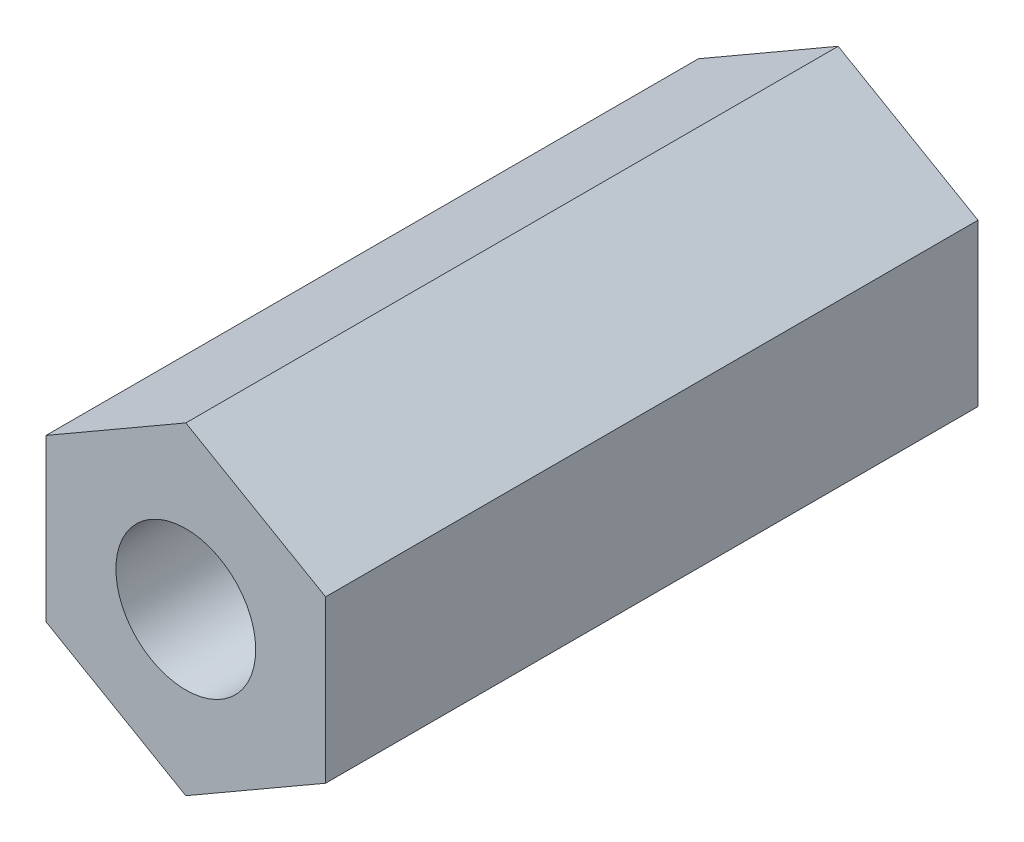
ISO-10303-21;
HEADER;
FILE_DESCRIPTION(('STEP AP214'),'2;1');
FILE_NAME('part.step','',(''),(''),'','','');
FILE_SCHEMA(('AUTOMOTIVE_DESIGN { 1 0 10303 214 1 1 1 1 }'));
ENDSEC;
DATA;
#1=APPLICATION_CONTEXT('core data for automotive mechanical design processes');
#2=APPLICATION_PROTOCOL_DEFINITION('international standard','automotive_design',2000,#1);
#3=PRODUCT_CONTEXT('',#1,'mechanical');
#4=PRODUCT('Part','Part','',(#3));
#5=PRODUCT_RELATED_PRODUCT_CATEGORY('part','',(#4));
#6=PRODUCT_DEFINITION_FORMATION('','',#4);
#7=PRODUCT_DEFINITION_CONTEXT('part definition',#1,'design');
#8=PRODUCT_DEFINITION('design','',#6,#7);
#9=PRODUCT_DEFINITION_SHAPE('','',#8);
#10=(LENGTH_UNIT() NAMED_UNIT(*) SI_UNIT(.MILLI.,.METRE.));
#11=(NAMED_UNIT(*) PLANE_ANGLE_UNIT() SI_UNIT($,.RADIAN.));
#12=(NAMED_UNIT(*) SI_UNIT($,.STERADIAN.) SOLID_ANGLE_UNIT());
#13=UNCERTAINTY_MEASURE_WITH_UNIT(LENGTH_MEASURE(1.E-05),#10,'distance_accuracy_value','');
#14=(GEOMETRIC_REPRESENTATION_CONTEXT(3) GLOBAL_UNCERTAINTY_ASSIGNED_CONTEXT((#13)) GLOBAL_UNIT_ASSIGNED_CONTEXT((#10,
#11,#12)) REPRESENTATION_CONTEXT('',''));
#15=CARTESIAN_POINT('',(0.,0.,0.));
#16=DIRECTION('',(0.,0.,1.));
#17=DIRECTION('',(1.,0.,0.));
#18=AXIS2_PLACEMENT_3D('',#15,#16,#17);
#19=CARTESIAN_POINT('',(0.,3.46410161513769,6.99999999999978));
#20=DIRECTION('',(0.,0.,1.));
#21=DIRECTION('',(1.,0.,0.));
#22=AXIS2_PLACEMENT_3D('',#19,#20,#21);
#23=PLANE('',#22);
#24=DIRECTION('',(-0.866025403784441,0.500000000000001,0.));
#25=VECTOR('',#24,1.);
#26=CARTESIAN_POINT('',(3.00000000000007,1.73205080756883,6.9999999999999));
#27=LINE('',#26,#25);
#28=CARTESIAN_POINT('',(3.00000000000007,1.73205080756883,6.9999999999999));
#29=VERTEX_POINT('',#28);
#30=CARTESIAN_POINT('',(0.,3.46410161513769,6.99999999999978));
#31=VERTEX_POINT('',#30);
#32=EDGE_CURVE('E128',#29,#31,#27,.T.);
#33=ORIENTED_EDGE('',*,*,#32,.T.);
#34=DIRECTION('',(-0.86602540378444,-0.500000000000002,0.));
#35=VECTOR('',#34,1.);
#36=CARTESIAN_POINT('',(0.,3.46410161513769,6.99999999999978));
#37=LINE('',#36,#35);
#38=CARTESIAN_POINT('',(-3.00000000000006,1.73205080756875,7.00000000000001));
#39=VERTEX_POINT('',#38);
#40=EDGE_CURVE('E95',#31,#39,#37,.T.);
#41=ORIENTED_EDGE('',*,*,#40,.T.);
#42=DIRECTION('',(0.,-1.,0.));
#43=VECTOR('',#42,1.);
#44=CARTESIAN_POINT('',(-3.00000000000006,1.73205080756875,7.00000000000001));
#45=LINE('',#44,#43);
#46=CARTESIAN_POINT('',(-3.00000000000001,-1.732050807569,7.00000000000001));
#47=VERTEX_POINT('',#46);
#48=EDGE_CURVE('E131',#39,#47,#45,.T.);
#49=ORIENTED_EDGE('',*,*,#48,.T.);
#50=DIRECTION('',(0.866025403784441,-0.500000000000001,0.));
#51=VECTOR('',#50,1.);
#52=CARTESIAN_POINT('',(-3.00000000000001,-1.732050807569,7.00000000000001));
#53=LINE('',#52,#51);
#54=CARTESIAN_POINT('',(-1.11022302462516E-13,-3.46410161513777,7.00000000000012));
#55=VERTEX_POINT('',#54);
#56=EDGE_CURVE('E133',#47,#55,#53,.T.);
#57=ORIENTED_EDGE('',*,*,#56,.T.);
#58=DIRECTION('',(0.86602540378444,0.500000000000002,0.));
#59=VECTOR('',#58,1.);
#60=CARTESIAN_POINT('',(-1.11022302462516E-13,-3.46410161513777,7.00000000000012));
#61=LINE('',#60,#59);
#62=CARTESIAN_POINT('',(3.00000000000001,-1.73205080756897,7.00000000000012));
#63=VERTEX_POINT('',#62);
#64=EDGE_CURVE('E59',#55,#63,#61,.T.);
#65=ORIENTED_EDGE('',*,*,#64,.T.);
#66=DIRECTION('',(0.,1.,0.));
#67=VECTOR('',#66,1.);
#68=CARTESIAN_POINT('',(3.00000000000001,-1.73205080756897,7.00000000000012));
#69=LINE('',#68,#67);
#70=EDGE_CURVE('E54',#63,#29,#69,.T.);
#71=ORIENTED_EDGE('',*,*,#70,.T.);
#72=EDGE_LOOP('',(#33,#41,#49,#57,#65,#71));
#73=FACE_BOUND('',#72,.T.);
#74=CARTESIAN_POINT('',(0.,0.,7.00000000000001));
#75=DIRECTION('',(0.,0.,1.));
#76=DIRECTION('',(1.,0.,0.));
#77=AXIS2_PLACEMENT_3D('',#74,#75,#76);
#78=CIRCLE('',#77,1.5);
#79=CARTESIAN_POINT('',(1.5,0.,7.00000000000001));
#80=VERTEX_POINT('',#79);
#81=EDGE_CURVE('E125',#80,#80,#78,.T.);
#82=ORIENTED_EDGE('',*,*,#81,.F.);
#83=EDGE_LOOP('',(#82));
#84=FACE_BOUND('',#83,.T.);
#85=ADVANCED_FACE('F39',(#73,#84),#23,.T.);
#86=CARTESIAN_POINT('',(3.00000000000007,1.73205080756883,6.9999999999999));
#87=DIRECTION('',(-0.5,-0.866025403784442,0.));
#88=DIRECTION('',(0.866025403784441,-0.500000000000001,0.));
#89=AXIS2_PLACEMENT_3D('',#86,#87,#88);
#90=PLANE('',#89);
#91=DIRECTION('',(0.,0.,-1.));
#92=VECTOR('',#91,1.);
#93=CARTESIAN_POINT('',(3.00000000000007,1.73205080756883,6.9999999999999));
#94=LINE('',#93,#92);
#95=CARTESIAN_POINT('',(3.00000000000006,1.73205080756877,-7.00000000000012));
#96=VERTEX_POINT('',#95);
#97=EDGE_CURVE('E110',#29,#96,#94,.T.);
#98=ORIENTED_EDGE('',*,*,#97,.T.);
#99=DIRECTION('',(-0.866025403784441,0.500000000000001,0.));
#100=VECTOR('',#99,1.);
#101=CARTESIAN_POINT('',(3.00000000000006,1.73205080756877,-7.00000000000012));
#102=LINE('',#101,#100);
#103=CARTESIAN_POINT('',(-1.17961196366423E-13,3.4641016151376,-7.00000000000023));
#104=VERTEX_POINT('',#103);
#105=EDGE_CURVE('E104',#96,#104,#102,.T.);
#106=ORIENTED_EDGE('',*,*,#105,.T.);
#107=DIRECTION('',(0.,0.,-1.));
#108=VECTOR('',#107,1.);
#109=CARTESIAN_POINT('',(0.,3.46410161513769,6.99999999999978));
#110=LINE('',#109,#108);
#111=EDGE_CURVE('E11',#31,#104,#110,.T.);
#112=ORIENTED_EDGE('',*,*,#111,.F.);
#113=ORIENTED_EDGE('',*,*,#32,.F.);
#114=EDGE_LOOP('',(#98,#106,#112,#113));
#115=FACE_BOUND('',#114,.T.);
#116=ADVANCED_FACE('F41',(#115),#90,.F.);
#117=CARTESIAN_POINT('',(0.,3.46410161513769,6.99999999999978));
#118=DIRECTION('',(0.500000000000002,-0.866025403784441,0.));
#119=DIRECTION('',(0.86602540378444,0.500000000000002,0.));
#120=AXIS2_PLACEMENT_3D('',#117,#118,#119);
#121=PLANE('',#120);
#122=ORIENTED_EDGE('',*,*,#111,.T.);
#123=DIRECTION('',(-0.86602540378444,-0.500000000000002,0.));
#124=VECTOR('',#123,1.);
#125=CARTESIAN_POINT('',(-1.17961196366423E-13,3.4641016151376,-7.00000000000023));
#126=LINE('',#125,#124);
#127=CARTESIAN_POINT('',(-3.00000000000005,1.73205080756872,-7.00000000000001));
#128=VERTEX_POINT('',#127);
#129=EDGE_CURVE('E94',#104,#128,#126,.T.);
#130=ORIENTED_EDGE('',*,*,#129,.T.);
#131=DIRECTION('',(0.,0.,-1.));
#132=VECTOR('',#131,1.);
#133=CARTESIAN_POINT('',(-3.00000000000006,1.73205080756875,7.00000000000001));
#134=LINE('',#133,#132);
#135=EDGE_CURVE('E47',#39,#128,#134,.T.);
#136=ORIENTED_EDGE('',*,*,#135,.F.);
#137=ORIENTED_EDGE('',*,*,#40,.F.);
#138=EDGE_LOOP('',(#122,#130,#136,#137));
#139=FACE_BOUND('',#138,.T.);
#140=ADVANCED_FACE('F92',(#139),#121,.F.);
#141=CARTESIAN_POINT('',(-3.00000000000006,1.73205080756875,7.00000000000001));
#142=DIRECTION('',(1.,0.,0.));
#143=DIRECTION('',(0.,0.,-1.));
#144=AXIS2_PLACEMENT_3D('',#141,#142,#143);
#145=PLANE('',#144);
#146=ORIENTED_EDGE('',*,*,#135,.T.);
#147=DIRECTION('',(0.,-1.,0.));
#148=VECTOR('',#147,1.);
#149=CARTESIAN_POINT('',(-3.00000000000005,1.73205080756872,-7.00000000000001));
#150=LINE('',#149,#148);
#151=CARTESIAN_POINT('',(-3.00000000000001,-1.73205080756905,-7.00000000000001));
#152=VERTEX_POINT('',#151);
#153=EDGE_CURVE('E108',#128,#152,#150,.T.);
#154=ORIENTED_EDGE('',*,*,#153,.T.);
#155=DIRECTION('',(0.,0.,-1.));
#156=VECTOR('',#155,1.);
#157=CARTESIAN_POINT('',(-3.00000000000001,-1.732050807569,7.00000000000001));
#158=LINE('',#157,#156);
#159=EDGE_CURVE('E142',#47,#152,#158,.T.);
#160=ORIENTED_EDGE('',*,*,#159,.F.);
#161=ORIENTED_EDGE('',*,*,#48,.F.);
#162=EDGE_LOOP('',(#146,#154,#160,#161));
#163=FACE_BOUND('',#162,.T.);
#164=ADVANCED_FACE('F145',(#163),#145,.F.);
#165=CARTESIAN_POINT('',(-3.00000000000001,-1.732050807569,7.00000000000001));
#166=DIRECTION('',(0.5,0.866025403784442,0.));
#167=DIRECTION('',(-0.866025403784441,0.500000000000001,0.));
#168=AXIS2_PLACEMENT_3D('',#165,#166,#167);
#169=PLANE('',#168);
#170=ORIENTED_EDGE('',*,*,#159,.T.);
#171=DIRECTION('',(0.866025403784441,-0.500000000000001,0.));
#172=VECTOR('',#171,1.);
#173=CARTESIAN_POINT('',(-3.00000000000001,-1.73205080756905,-7.00000000000001));
#174=LINE('',#173,#172);
#175=CARTESIAN_POINT('',(0.,-3.46410161513799,-6.9999999999999));
#176=VERTEX_POINT('',#175);
#177=EDGE_CURVE('E117',#152,#176,#174,.T.);
#178=ORIENTED_EDGE('',*,*,#177,.T.);
#179=DIRECTION('',(0.,0.,-1.));
#180=VECTOR('',#179,1.);
#181=CARTESIAN_POINT('',(-1.11022302462516E-13,-3.46410161513777,7.00000000000012));
#182=LINE('',#181,#180);
#183=EDGE_CURVE('E140',#55,#176,#182,.T.);
#184=ORIENTED_EDGE('',*,*,#183,.F.);
#185=ORIENTED_EDGE('',*,*,#56,.F.);
#186=EDGE_LOOP('',(#170,#178,#184,#185));
#187=FACE_BOUND('',#186,.T.);
#188=ADVANCED_FACE('F151',(#187),#169,.F.);
#189=CARTESIAN_POINT('',(-1.11022302462516E-13,-3.46410161513777,7.00000000000012));
#190=DIRECTION('',(-0.500000000000002,0.866025403784442,0.));
#191=DIRECTION('',(-0.86602540378444,-0.500000000000002,0.));
#192=AXIS2_PLACEMENT_3D('',#189,#190,#191);
#193=PLANE('',#192);
#194=ORIENTED_EDGE('',*,*,#183,.T.);
#195=DIRECTION('',(0.86602540378444,0.500000000000002,0.));
#196=VECTOR('',#195,1.);
#197=CARTESIAN_POINT('',(0.,-3.46410161513799,-6.9999999999999));
#198=LINE('',#197,#196);
#199=CARTESIAN_POINT('',(3.00000000000001,-1.73205080756902,-6.9999999999999));
#200=VERTEX_POINT('',#199);
#201=EDGE_CURVE('E120',#176,#200,#198,.T.);
#202=ORIENTED_EDGE('',*,*,#201,.T.);
#203=DIRECTION('',(0.,0.,-1.));
#204=VECTOR('',#203,1.);
#205=CARTESIAN_POINT('',(3.00000000000001,-1.73205080756897,7.00000000000012));
#206=LINE('',#205,#204);
#207=EDGE_CURVE('E138',#63,#200,#206,.T.);
#208=ORIENTED_EDGE('',*,*,#207,.F.);
#209=ORIENTED_EDGE('',*,*,#64,.F.);
#210=EDGE_LOOP('',(#194,#202,#208,#209));
#211=FACE_BOUND('',#210,.T.);
#212=ADVANCED_FACE('F154',(#211),#193,.F.);
#213=CARTESIAN_POINT('',(3.00000000000001,-1.73205080756897,7.00000000000012));
#214=DIRECTION('',(-1.,0.,0.));
#215=DIRECTION('',(0.,-1.,0.));
#216=AXIS2_PLACEMENT_3D('',#213,#214,#215);
#217=PLANE('',#216);
#218=ORIENTED_EDGE('',*,*,#207,.T.);
#219=DIRECTION('',(0.,1.,0.));
#220=VECTOR('',#219,1.);
#221=CARTESIAN_POINT('',(3.00000000000001,-1.73205080756902,-6.9999999999999));
#222=LINE('',#221,#220);
#223=EDGE_CURVE('E123',#200,#96,#222,.T.);
#224=ORIENTED_EDGE('',*,*,#223,.T.);
#225=ORIENTED_EDGE('',*,*,#97,.F.);
#226=ORIENTED_EDGE('',*,*,#70,.F.);
#227=EDGE_LOOP('',(#218,#224,#225,#226));
#228=FACE_BOUND('',#227,.T.);
#229=ADVANCED_FACE('F156',(#228),#217,.F.);
#230=CARTESIAN_POINT('',(0.,0.,7.00000000000001));
#231=DIRECTION('',(0.,0.,-1.));
#232=DIRECTION('',(-1.,0.,0.));
#233=AXIS2_PLACEMENT_3D('',#230,#231,#232);
#234=CYLINDRICAL_SURFACE('',#233,1.5);
#235=ORIENTED_EDGE('',*,*,#81,.T.);
#236=EDGE_LOOP('',(#235));
#237=FACE_BOUND('',#236,.T.);
#238=CARTESIAN_POINT('',(0.,0.,-7.00000000000001));
#239=DIRECTION('',(0.,0.,1.));
#240=DIRECTION('',(1.,0.,0.));
#241=AXIS2_PLACEMENT_3D('',#238,#239,#240);
#242=CIRCLE('',#241,1.5);
#243=CARTESIAN_POINT('',(1.5,0.,-7.00000000000001));
#244=VERTEX_POINT('',#243);
#245=EDGE_CURVE('E111',#244,#244,#242,.T.);
#246=ORIENTED_EDGE('',*,*,#245,.F.);
#247=EDGE_LOOP('',(#246));
#248=FACE_BOUND('',#247,.T.);
#249=ADVANCED_FACE('F158',(#237,#248),#234,.F.);
#250=CARTESIAN_POINT('',(-1.17961196366423E-13,3.4641016151376,-7.00000000000023));
#251=DIRECTION('',(0.,0.,1.));
#252=DIRECTION('',(1.,0.,0.));
#253=AXIS2_PLACEMENT_3D('',#250,#251,#252);
#254=PLANE('',#253);
#255=ORIENTED_EDGE('',*,*,#245,.T.);
#256=EDGE_LOOP('',(#255));
#257=FACE_BOUND('',#256,.T.);
#258=ORIENTED_EDGE('',*,*,#105,.F.);
#259=ORIENTED_EDGE('',*,*,#223,.F.);
#260=ORIENTED_EDGE('',*,*,#201,.F.);
#261=ORIENTED_EDGE('',*,*,#177,.F.);
#262=ORIENTED_EDGE('',*,*,#153,.F.);
#263=ORIENTED_EDGE('',*,*,#129,.F.);
#264=EDGE_LOOP('',(#258,#259,#260,#261,#262,#263));
#265=FACE_BOUND('',#264,.T.);
#266=ADVANCED_FACE('F102',(#257,#265),#254,.F.);
#267=CLOSED_SHELL('',(#85,#116,#140,#164,#188,#212,#229,#249,#266));
#268=MANIFOLD_SOLID_BREP('B2',#267);
#269=ADVANCED_BREP_SHAPE_REPRESENTATION('',(#18,#268),#14);
#270=SHAPE_DEFINITION_REPRESENTATION(#9,#269);
ENDSEC;
END-ISO-10303-21;
